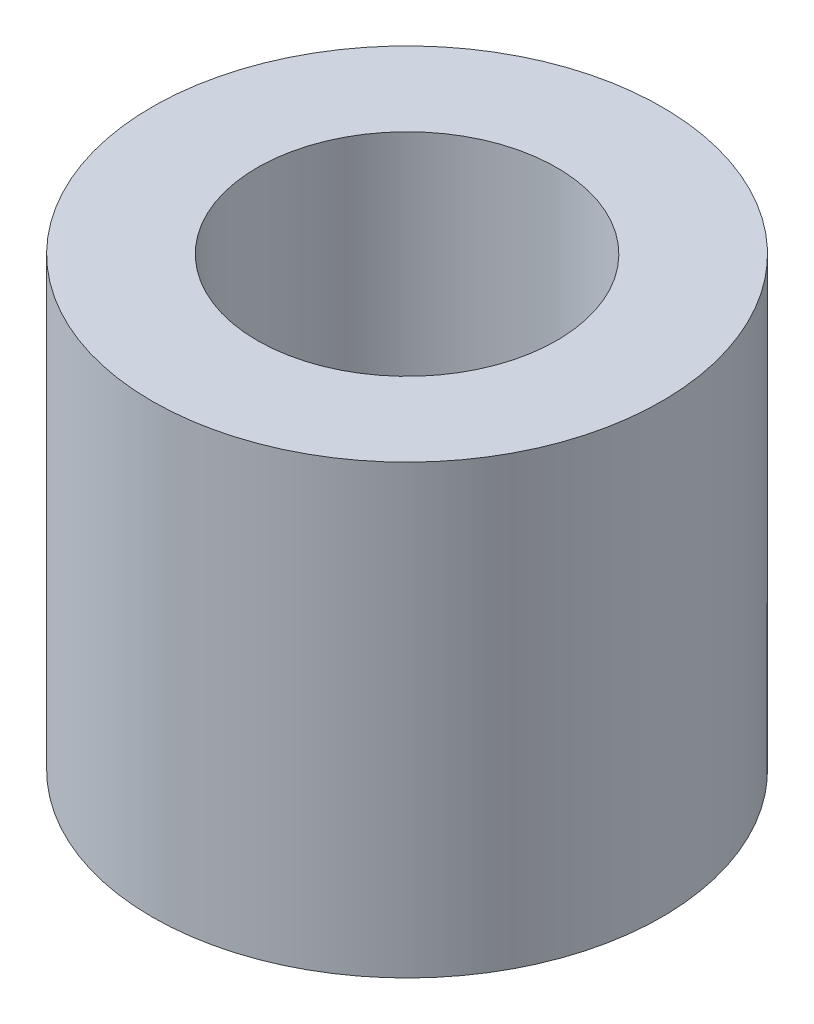
ISO-10303-21;
HEADER;
FILE_DESCRIPTION(('STEP AP214'),'2;1');
FILE_NAME('part.step','',(''),(''),'','','');
FILE_SCHEMA(('AUTOMOTIVE_DESIGN { 1 0 10303 214 1 1 1 1 }'));
ENDSEC;
DATA;
#1=APPLICATION_CONTEXT('core data for automotive mechanical design processes');
#2=APPLICATION_PROTOCOL_DEFINITION('international standard','automotive_design',2000,#1);
#3=PRODUCT_CONTEXT('',#1,'mechanical');
#4=PRODUCT('Part','Part','',(#3));
#5=PRODUCT_RELATED_PRODUCT_CATEGORY('part','',(#4));
#6=PRODUCT_DEFINITION_FORMATION('','',#4);
#7=PRODUCT_DEFINITION_CONTEXT('part definition',#1,'design');
#8=PRODUCT_DEFINITION('design','',#6,#7);
#9=PRODUCT_DEFINITION_SHAPE('','',#8);
#10=(LENGTH_UNIT() NAMED_UNIT(*) SI_UNIT(.MILLI.,.METRE.));
#11=(NAMED_UNIT(*) PLANE_ANGLE_UNIT() SI_UNIT($,.RADIAN.));
#12=(NAMED_UNIT(*) SI_UNIT($,.STERADIAN.) SOLID_ANGLE_UNIT());
#13=UNCERTAINTY_MEASURE_WITH_UNIT(LENGTH_MEASURE(1.E-05),#10,'distance_accuracy_value','');
#14=(GEOMETRIC_REPRESENTATION_CONTEXT(3) GLOBAL_UNCERTAINTY_ASSIGNED_CONTEXT((#13)) GLOBAL_UNIT_ASSIGNED_CONTEXT((#10,
#11,#12)) REPRESENTATION_CONTEXT('',''));
#15=CARTESIAN_POINT('',(0.,0.,0.));
#16=DIRECTION('',(0.,0.,1.));
#17=DIRECTION('',(1.,0.,0.));
#18=AXIS2_PLACEMENT_3D('',#15,#16,#17);
#19=CARTESIAN_POINT('',(0.,4.25,0.));
#20=DIRECTION('',(0.,1.,0.));
#21=DIRECTION('',(0.,0.,1.));
#22=AXIS2_PLACEMENT_3D('',#19,#20,#21);
#23=PLANE('',#22);
#24=CARTESIAN_POINT('',(0.,4.25,0.));
#25=DIRECTION('',(0.,1.,0.));
#26=DIRECTION('',(0.,0.,1.));
#27=AXIS2_PLACEMENT_3D('',#24,#25,#26);
#28=CIRCLE('',#27,2.425);
#29=CARTESIAN_POINT('',(0.,4.25,2.425));
#30=VERTEX_POINT('',#29);
#31=EDGE_CURVE('E10',#30,#30,#28,.T.);
#32=ORIENTED_EDGE('',*,*,#31,.T.);
#33=EDGE_LOOP('',(#32));
#34=FACE_BOUND('',#33,.T.);
#35=CARTESIAN_POINT('',(0.,4.25,0.));
#36=DIRECTION('',(0.,1.,0.));
#37=DIRECTION('',(0.,0.,1.));
#38=AXIS2_PLACEMENT_3D('',#35,#36,#37);
#39=CIRCLE('',#38,1.425);
#40=CARTESIAN_POINT('',(0.,4.25,1.425));
#41=VERTEX_POINT('',#40);
#42=EDGE_CURVE('E48',#41,#41,#39,.T.);
#43=ORIENTED_EDGE('',*,*,#42,.F.);
#44=EDGE_LOOP('',(#43));
#45=FACE_BOUND('',#44,.T.);
#46=ADVANCED_FACE('F40',(#34,#45),#23,.T.);
#47=CARTESIAN_POINT('',(0.,0.,0.));
#48=DIRECTION('',(0.,1.,0.));
#49=DIRECTION('',(0.,0.,1.));
#50=AXIS2_PLACEMENT_3D('',#47,#48,#49);
#51=PLANE('',#50);
#52=CARTESIAN_POINT('',(0.,0.,0.));
#53=DIRECTION('',(0.,1.,0.));
#54=DIRECTION('',(0.,0.,1.));
#55=AXIS2_PLACEMENT_3D('',#52,#53,#54);
#56=CIRCLE('',#55,2.425);
#57=CARTESIAN_POINT('',(0.,0.,2.425));
#58=VERTEX_POINT('',#57);
#59=EDGE_CURVE('E41',#58,#58,#56,.T.);
#60=ORIENTED_EDGE('',*,*,#59,.F.);
#61=EDGE_LOOP('',(#60));
#62=FACE_BOUND('',#61,.T.);
#63=CARTESIAN_POINT('',(0.,0.,0.));
#64=DIRECTION('',(0.,1.,0.));
#65=DIRECTION('',(0.,0.,1.));
#66=AXIS2_PLACEMENT_3D('',#63,#64,#65);
#67=CIRCLE('',#66,1.425);
#68=CARTESIAN_POINT('',(0.,0.,1.425));
#69=VERTEX_POINT('',#68);
#70=EDGE_CURVE('E49',#69,#69,#67,.T.);
#71=ORIENTED_EDGE('',*,*,#70,.T.);
#72=EDGE_LOOP('',(#71));
#73=FACE_BOUND('',#72,.T.);
#74=ADVANCED_FACE('F58',(#62,#73),#51,.F.);
#75=CARTESIAN_POINT('',(0.,4.25,0.));
#76=DIRECTION('',(0.,-1.,0.));
#77=DIRECTION('',(0.,0.,-1.));
#78=AXIS2_PLACEMENT_3D('',#75,#76,#77);
#79=CYLINDRICAL_SURFACE('',#78,2.425);
#80=ORIENTED_EDGE('',*,*,#31,.F.);
#81=EDGE_LOOP('',(#80));
#82=FACE_BOUND('',#81,.T.);
#83=ORIENTED_EDGE('',*,*,#59,.T.);
#84=EDGE_LOOP('',(#83));
#85=FACE_BOUND('',#84,.T.);
#86=ADVANCED_FACE('F39',(#82,#85),#79,.T.);
#87=CARTESIAN_POINT('',(0.,4.25,0.));
#88=DIRECTION('',(0.,-1.,0.));
#89=DIRECTION('',(0.,0.,-1.));
#90=AXIS2_PLACEMENT_3D('',#87,#88,#89);
#91=CYLINDRICAL_SURFACE('',#90,1.425);
#92=ORIENTED_EDGE('',*,*,#42,.T.);
#93=EDGE_LOOP('',(#92));
#94=FACE_BOUND('',#93,.T.);
#95=ORIENTED_EDGE('',*,*,#70,.F.);
#96=EDGE_LOOP('',(#95));
#97=FACE_BOUND('',#96,.T.);
#98=ADVANCED_FACE('F57',(#94,#97),#91,.F.);
#99=CLOSED_SHELL('',(#46,#74,#86,#98));
#100=MANIFOLD_SOLID_BREP('B2',#99);
#101=ADVANCED_BREP_SHAPE_REPRESENTATION('',(#18,#100),#14);
#102=SHAPE_DEFINITION_REPRESENTATION(#9,#101);
ENDSEC;
END-ISO-10303-21;
